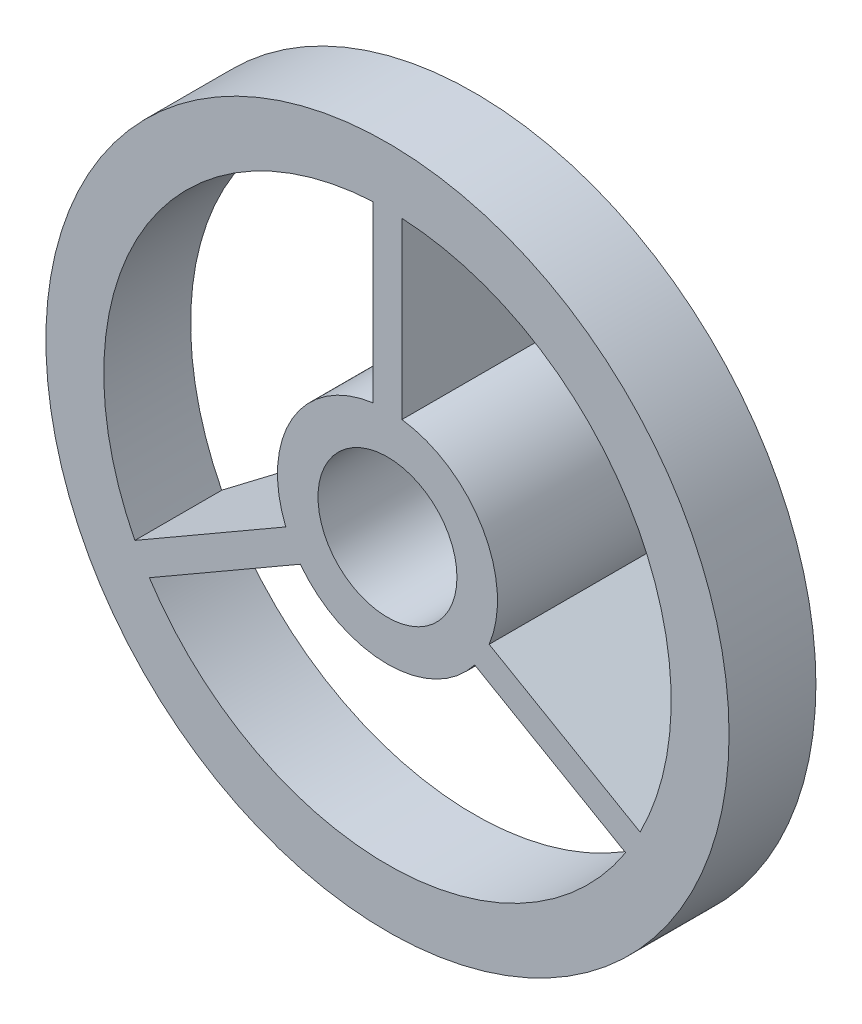
ISO-10303-21;
HEADER;
FILE_DESCRIPTION(('STEP AP214'),'2;1');
FILE_NAME('part.step','',(''),(''),'','','');
FILE_SCHEMA(('AUTOMOTIVE_DESIGN { 1 0 10303 214 1 1 1 1 }'));
ENDSEC;
DATA;
#1=APPLICATION_CONTEXT('core data for automotive mechanical design processes');
#2=APPLICATION_PROTOCOL_DEFINITION('international standard','automotive_design',2000,#1);
#3=PRODUCT_CONTEXT('',#1,'mechanical');
#4=PRODUCT('Part','Part','',(#3));
#5=PRODUCT_RELATED_PRODUCT_CATEGORY('part','',(#4));
#6=PRODUCT_DEFINITION_FORMATION('','',#4);
#7=PRODUCT_DEFINITION_CONTEXT('part definition',#1,'design');
#8=PRODUCT_DEFINITION('design','',#6,#7);
#9=PRODUCT_DEFINITION_SHAPE('','',#8);
#10=(LENGTH_UNIT() NAMED_UNIT(*) SI_UNIT(.MILLI.,.METRE.));
#11=(NAMED_UNIT(*) PLANE_ANGLE_UNIT() SI_UNIT($,.RADIAN.));
#12=(NAMED_UNIT(*) SI_UNIT($,.STERADIAN.) SOLID_ANGLE_UNIT());
#13=UNCERTAINTY_MEASURE_WITH_UNIT(LENGTH_MEASURE(1.E-05),#10,'distance_accuracy_value','');
#14=(GEOMETRIC_REPRESENTATION_CONTEXT(3) GLOBAL_UNCERTAINTY_ASSIGNED_CONTEXT((#13)) GLOBAL_UNIT_ASSIGNED_CONTEXT((#10,
#11,#12)) REPRESENTATION_CONTEXT('',''));
#15=CARTESIAN_POINT('',(0.,0.,0.));
#16=DIRECTION('',(0.,0.,1.));
#17=DIRECTION('',(1.,0.,0.));
#18=AXIS2_PLACEMENT_3D('',#15,#16,#17);
#19=CARTESIAN_POINT('',(0.,0.,3.5));
#20=DIRECTION('',(0.,0.,-1.));
#21=DIRECTION('',(-1.,0.,0.));
#22=AXIS2_PLACEMENT_3D('',#19,#20,#21);
#23=CYLINDRICAL_SURFACE('',#22,1.9);
#24=DIRECTION('',(0.,0.,-1.));
#25=VECTOR('',#24,1.);
#26=CARTESIAN_POINT('',(1.75614223781987,-0.725234059145742,3.5));
#27=LINE('',#26,#25);
#28=CARTESIAN_POINT('',(1.75614223781987,-0.725234059145742,0.));
#29=VERTEX_POINT('',#28);
#30=CARTESIAN_POINT('',(1.75614223781987,-0.725234059145742,3.5));
#31=VERTEX_POINT('',#30);
#32=EDGE_CURVE('E210',#29,#31,#27,.F.);
#33=ORIENTED_EDGE('',*,*,#32,.F.);
#34=CARTESIAN_POINT('',(0.,0.,0.));
#35=DIRECTION('',(0.,0.,1.));
#36=DIRECTION('',(1.,0.,0.));
#37=AXIS2_PLACEMENT_3D('',#34,#35,#36);
#38=CIRCLE('',#37,1.9);
#39=CARTESIAN_POINT('',(0.25,1.88348082018374,0.));
#40=VERTEX_POINT('',#39);
#41=EDGE_CURVE('E332',#29,#40,#38,.T.);
#42=ORIENTED_EDGE('',*,*,#41,.T.);
#43=DIRECTION('',(0.,0.,-1.));
#44=VECTOR('',#43,1.);
#45=CARTESIAN_POINT('',(0.25,1.88348082018374,3.5));
#46=LINE('',#45,#44);
#47=CARTESIAN_POINT('',(0.25,1.88348082018374,3.5));
#48=VERTEX_POINT('',#47);
#49=EDGE_CURVE('E350',#40,#48,#46,.F.);
#50=ORIENTED_EDGE('',*,*,#49,.T.);
#51=CARTESIAN_POINT('',(0.,0.,3.5));
#52=DIRECTION('',(0.,0.,1.));
#53=DIRECTION('',(1.,0.,0.));
#54=AXIS2_PLACEMENT_3D('',#51,#52,#53);
#55=CIRCLE('',#54,1.9);
#56=EDGE_CURVE('E342',#31,#48,#55,.T.);
#57=ORIENTED_EDGE('',*,*,#56,.F.);
#58=EDGE_LOOP('',(#33,#42,#50,#57));
#59=FACE_BOUND('',#58,.T.);
#60=ADVANCED_FACE('F39',(#59),#23,.T.);
#61=CARTESIAN_POINT('',(0.,0.,2.));
#62=DIRECTION('',(0.,0.,1.));
#63=DIRECTION('',(1.,0.,0.));
#64=AXIS2_PLACEMENT_3D('',#61,#62,#63);
#65=PLANE('',#64);
#66=CARTESIAN_POINT('',(0.,0.,2.));
#67=DIRECTION('',(0.,0.,1.));
#68=DIRECTION('',(1.,0.,0.));
#69=AXIS2_PLACEMENT_3D('',#66,#67,#68);
#70=CIRCLE('',#69,5.9);
#71=CARTESIAN_POINT('',(5.9,0.,2.));
#72=VERTEX_POINT('',#71);
#73=EDGE_CURVE('E278',#72,#72,#70,.T.);
#74=ORIENTED_EDGE('',*,*,#73,.F.);
#75=EDGE_LOOP('',(#74));
#76=FACE_BOUND('',#75,.T.);
#77=CARTESIAN_POINT('',(0.,0.,2.));
#78=DIRECTION('',(0.,0.,1.));
#79=DIRECTION('',(1.,0.,0.));
#80=AXIS2_PLACEMENT_3D('',#77,#78,#79);
#81=CIRCLE('',#80,4.9);
#82=CARTESIAN_POINT('',(-4.11299775837599,-2.66331549756954,2.));
#83=VERTEX_POINT('',#82);
#84=CARTESIAN_POINT('',(4.11299775837602,-2.66331549756949,2.));
#85=VERTEX_POINT('',#84);
#86=EDGE_CURVE('E272',#83,#85,#81,.T.);
#87=ORIENTED_EDGE('',*,*,#86,.T.);
#88=DIRECTION('',(0.866025403784443,-0.499999999999992,0.));
#89=VECTOR('',#88,1.);
#90=CARTESIAN_POINT('',(-0.124999999999998,-0.216506350946111,2.));
#91=LINE('',#90,#89);
#92=CARTESIAN_POINT('',(4.11852447854377,-2.66650635094607,2.));
#93=VERTEX_POINT('',#92);
#94=EDGE_CURVE('E217',#85,#93,#91,.T.);
#95=ORIENTED_EDGE('',*,*,#94,.T.);
#96=DIRECTION('',(0.499999999999992,0.866025403784443,0.));
#97=VECTOR('',#96,1.);
#98=CARTESIAN_POINT('',(4.11852447854377,-2.66650635094607,2.));
#99=LINE('',#98,#97);
#100=CARTESIAN_POINT('',(4.36852447854377,-2.23349364905385,2.));
#101=VERTEX_POINT('',#100);
#102=EDGE_CURVE('E55',#93,#101,#99,.T.);
#103=ORIENTED_EDGE('',*,*,#102,.T.);
#104=DIRECTION('',(0.866025403784443,-0.499999999999992,0.));
#105=VECTOR('',#104,1.);
#106=CARTESIAN_POINT('',(0.124999999999998,0.216506350946111,2.));
#107=LINE('',#106,#105);
#108=CARTESIAN_POINT('',(4.36299775837602,-2.23030279567726,2.));
#109=VERTEX_POINT('',#108);
#110=EDGE_CURVE('E207',#109,#101,#107,.T.);
#111=ORIENTED_EDGE('',*,*,#110,.F.);
#112=CARTESIAN_POINT('',(0.25,4.89361829324683,2.));
#113=VERTEX_POINT('',#112);
#114=EDGE_CURVE('E273',#109,#113,#81,.T.);
#115=ORIENTED_EDGE('',*,*,#114,.T.);
#116=DIRECTION('',(0.,-1.,0.));
#117=VECTOR('',#116,1.);
#118=CARTESIAN_POINT('',(0.25,0.,2.));
#119=LINE('',#118,#117);
#120=CARTESIAN_POINT('',(0.25,4.9,2.));
#121=VERTEX_POINT('',#120);
#122=EDGE_CURVE('E292',#121,#113,#119,.T.);
#123=ORIENTED_EDGE('',*,*,#122,.F.);
#124=DIRECTION('',(-1.,0.,0.));
#125=VECTOR('',#124,1.);
#126=CARTESIAN_POINT('',(0.25,4.9,2.));
#127=LINE('',#126,#125);
#128=CARTESIAN_POINT('',(-0.25,4.9,2.));
#129=VERTEX_POINT('',#128);
#130=EDGE_CURVE('E312',#121,#129,#127,.T.);
#131=ORIENTED_EDGE('',*,*,#130,.T.);
#132=DIRECTION('',(0.,-1.,0.));
#133=VECTOR('',#132,1.);
#134=CARTESIAN_POINT('',(-0.25,0.,2.));
#135=LINE('',#134,#133);
#136=CARTESIAN_POINT('',(-0.25,4.89361829324683,2.));
#137=VERTEX_POINT('',#136);
#138=EDGE_CURVE('E296',#129,#137,#135,.T.);
#139=ORIENTED_EDGE('',*,*,#138,.T.);
#140=CARTESIAN_POINT('',(-4.36299775837599,-2.23030279567732,2.));
#141=VERTEX_POINT('',#140);
#142=EDGE_CURVE('E267',#137,#141,#81,.T.);
#143=ORIENTED_EDGE('',*,*,#142,.T.);
#144=DIRECTION('',(-0.866025403784436,-0.500000000000004,0.));
#145=VECTOR('',#144,1.);
#146=CARTESIAN_POINT('',(-0.125000000000001,0.216506350946109,2.));
#147=LINE('',#146,#145);
#148=CARTESIAN_POINT('',(-4.36852447854374,-2.23349364905391,2.));
#149=VERTEX_POINT('',#148);
#150=EDGE_CURVE('E259',#141,#149,#147,.T.);
#151=ORIENTED_EDGE('',*,*,#150,.T.);
#152=DIRECTION('',(0.500000000000004,-0.866025403784436,0.));
#153=VECTOR('',#152,1.);
#154=CARTESIAN_POINT('',(-4.36852447854374,-2.23349364905391,2.));
#155=LINE('',#154,#153);
#156=CARTESIAN_POINT('',(-4.11852447854374,-2.66650635094613,2.));
#157=VERTEX_POINT('',#156);
#158=EDGE_CURVE('E235',#149,#157,#155,.T.);
#159=ORIENTED_EDGE('',*,*,#158,.T.);
#160=DIRECTION('',(-0.866025403784436,-0.500000000000004,0.));
#161=VECTOR('',#160,1.);
#162=CARTESIAN_POINT('',(0.125000000000001,-0.216506350946109,2.));
#163=LINE('',#162,#161);
#164=EDGE_CURVE('E251',#83,#157,#163,.T.);
#165=ORIENTED_EDGE('',*,*,#164,.F.);
#166=EDGE_LOOP('',(#87,#95,#103,#111,#115,#123,#131,#139,#143,#151,#159,#165));
#167=FACE_BOUND('',#166,.T.);
#168=ADVANCED_FACE('F388',(#76,#167),#65,.F.);
#169=CARTESIAN_POINT('',(0.,0.,2.));
#170=DIRECTION('',(0.,0.,1.));
#171=DIRECTION('',(1.,0.,0.));
#172=AXIS2_PLACEMENT_3D('',#169,#170,#171);
#173=CYLINDRICAL_SURFACE('',#172,4.9);
#174=DIRECTION('',(0.,0.,1.));
#175=VECTOR('',#174,1.);
#176=CARTESIAN_POINT('',(4.36299775837602,-2.23030279567726,2.));
#177=LINE('',#176,#175);
#178=CARTESIAN_POINT('',(4.36299775837602,-2.23030279567726,3.5));
#179=VERTEX_POINT('',#178);
#180=EDGE_CURVE('E186',#179,#109,#177,.F.);
#181=ORIENTED_EDGE('',*,*,#180,.F.);
#182=CARTESIAN_POINT('',(0.,0.,3.5));
#183=DIRECTION('',(0.,0.,1.));
#184=DIRECTION('',(1.,0.,0.));
#185=AXIS2_PLACEMENT_3D('',#182,#183,#184);
#186=CIRCLE('',#185,4.9);
#187=CARTESIAN_POINT('',(0.25,4.89361829324683,3.5));
#188=VERTEX_POINT('',#187);
#189=EDGE_CURVE('E266',#179,#188,#186,.T.);
#190=ORIENTED_EDGE('',*,*,#189,.T.);
#191=DIRECTION('',(0.,0.,1.));
#192=VECTOR('',#191,1.);
#193=CARTESIAN_POINT('',(0.25,4.89361829324683,2.));
#194=LINE('',#193,#192);
#195=EDGE_CURVE('E288',#113,#188,#194,.T.);
#196=ORIENTED_EDGE('',*,*,#195,.F.);
#197=ORIENTED_EDGE('',*,*,#114,.F.);
#198=EDGE_LOOP('',(#181,#190,#196,#197));
#199=FACE_BOUND('',#198,.T.);
#200=ADVANCED_FACE('F376',(#199),#173,.F.);
#201=CARTESIAN_POINT('',(-1.50614223781986,-1.15824676103798,0.));
#202=VERTEX_POINT('',#201);
#203=CARTESIAN_POINT('',(1.50614223781988,-1.15824676103796,0.));
#204=VERTEX_POINT('',#203);
#205=EDGE_CURVE('E346',#202,#204,#38,.T.);
#206=ORIENTED_EDGE('',*,*,#205,.T.);
#207=DIRECTION('',(0.,0.,-1.));
#208=VECTOR('',#207,1.);
#209=CARTESIAN_POINT('',(1.50614223781988,-1.15824676103796,3.5));
#210=LINE('',#209,#208);
#211=CARTESIAN_POINT('',(1.50614223781988,-1.15824676103796,3.5));
#212=VERTEX_POINT('',#211);
#213=EDGE_CURVE('E171',#204,#212,#210,.F.);
#214=ORIENTED_EDGE('',*,*,#213,.T.);
#215=CARTESIAN_POINT('',(-1.50614223781986,-1.15824676103798,3.5));
#216=VERTEX_POINT('',#215);
#217=EDGE_CURVE('E341',#216,#212,#55,.T.);
#218=ORIENTED_EDGE('',*,*,#217,.F.);
#219=DIRECTION('',(0.,0.,-1.));
#220=VECTOR('',#219,1.);
#221=CARTESIAN_POINT('',(-1.50614223781986,-1.15824676103798,3.5));
#222=LINE('',#221,#220);
#223=EDGE_CURVE('E255',#202,#216,#222,.F.);
#224=ORIENTED_EDGE('',*,*,#223,.F.);
#225=EDGE_LOOP('',(#206,#214,#218,#224));
#226=FACE_BOUND('',#225,.T.);
#227=ADVANCED_FACE('F397',(#226),#23,.T.);
#228=CARTESIAN_POINT('',(-4.11299775837599,-2.66331549756954,3.5));
#229=VERTEX_POINT('',#228);
#230=CARTESIAN_POINT('',(4.11299775837602,-2.66331549756949,3.5));
#231=VERTEX_POINT('',#230);
#232=EDGE_CURVE('E277',#229,#231,#186,.T.);
#233=ORIENTED_EDGE('',*,*,#232,.T.);
#234=DIRECTION('',(0.,0.,1.));
#235=VECTOR('',#234,1.);
#236=CARTESIAN_POINT('',(4.11299775837602,-2.66331549756949,2.));
#237=LINE('',#236,#235);
#238=EDGE_CURVE('E214',#231,#85,#237,.F.);
#239=ORIENTED_EDGE('',*,*,#238,.T.);
#240=ORIENTED_EDGE('',*,*,#86,.F.);
#241=DIRECTION('',(0.,0.,1.));
#242=VECTOR('',#241,1.);
#243=CARTESIAN_POINT('',(-4.11299775837599,-2.66331549756954,2.));
#244=LINE('',#243,#242);
#245=EDGE_CURVE('E48',#229,#83,#244,.F.);
#246=ORIENTED_EDGE('',*,*,#245,.F.);
#247=EDGE_LOOP('',(#233,#239,#240,#246));
#248=FACE_BOUND('',#247,.T.);
#249=ADVANCED_FACE('F363',(#248),#173,.F.);
#250=CARTESIAN_POINT('',(0.25,0.,0.));
#251=DIRECTION('',(1.,0.,0.));
#252=DIRECTION('',(0.,0.,-1.));
#253=AXIS2_PLACEMENT_3D('',#250,#251,#252);
#254=PLANE('',#253);
#255=DIRECTION('',(0.,0.832050465519294,0.554699939452968));
#256=VECTOR('',#255,1.);
#257=CARTESIAN_POINT('',(0.25,1.89999799408724,0.));
#258=LINE('',#257,#256);
#259=CARTESIAN_POINT('',(0.25,1.89999799408724,0.));
#260=VERTEX_POINT('',#259);
#261=EDGE_CURVE('E308',#260,#121,#258,.T.);
#262=ORIENTED_EDGE('',*,*,#261,.T.);
#263=ORIENTED_EDGE('',*,*,#122,.T.);
#264=ORIENTED_EDGE('',*,*,#195,.T.);
#265=DIRECTION('',(0.,-1.,0.));
#266=VECTOR('',#265,1.);
#267=CARTESIAN_POINT('',(0.25,1.89999799408724,3.5));
#268=LINE('',#267,#266);
#269=EDGE_CURVE('E300',#188,#48,#268,.T.);
#270=ORIENTED_EDGE('',*,*,#269,.T.);
#271=ORIENTED_EDGE('',*,*,#49,.F.);
#272=DIRECTION('',(0.,1.,0.));
#273=VECTOR('',#272,1.);
#274=CARTESIAN_POINT('',(0.25,1.69999799408724,0.));
#275=LINE('',#274,#273);
#276=EDGE_CURVE('E304',#40,#260,#275,.T.);
#277=ORIENTED_EDGE('',*,*,#276,.T.);
#278=EDGE_LOOP('',(#262,#263,#264,#270,#271,#277));
#279=FACE_BOUND('',#278,.T.);
#280=ADVANCED_FACE('F381',(#279),#254,.T.);
#281=CARTESIAN_POINT('',(-0.25,0.,0.));
#282=DIRECTION('',(1.,0.,0.));
#283=DIRECTION('',(0.,0.,-1.));
#284=AXIS2_PLACEMENT_3D('',#281,#282,#283);
#285=PLANE('',#284);
#286=ORIENTED_EDGE('',*,*,#138,.F.);
#287=DIRECTION('',(0.,0.832050465519294,0.554699939452968));
#288=VECTOR('',#287,1.);
#289=CARTESIAN_POINT('',(-0.25,1.89999799408724,0.));
#290=LINE('',#289,#288);
#291=CARTESIAN_POINT('',(-0.25,1.89999799408724,0.));
#292=VERTEX_POINT('',#291);
#293=EDGE_CURVE('E316',#292,#129,#290,.T.);
#294=ORIENTED_EDGE('',*,*,#293,.F.);
#295=DIRECTION('',(0.,1.,0.));
#296=VECTOR('',#295,1.);
#297=CARTESIAN_POINT('',(-0.25,1.69999799408724,0.));
#298=LINE('',#297,#296);
#299=CARTESIAN_POINT('',(-0.25,1.88348082018374,0.));
#300=VERTEX_POINT('',#299);
#301=EDGE_CURVE('E299',#300,#292,#298,.T.);
#302=ORIENTED_EDGE('',*,*,#301,.F.);
#303=DIRECTION('',(0.,0.,-1.));
#304=VECTOR('',#303,1.);
#305=CARTESIAN_POINT('',(-0.25,1.88348082018374,3.5));
#306=LINE('',#305,#304);
#307=CARTESIAN_POINT('',(-0.25,1.88348082018374,3.5));
#308=VERTEX_POINT('',#307);
#309=EDGE_CURVE('E340',#300,#308,#306,.F.);
#310=ORIENTED_EDGE('',*,*,#309,.T.);
#311=DIRECTION('',(0.,-1.,0.));
#312=VECTOR('',#311,1.);
#313=CARTESIAN_POINT('',(-0.25,4.9,3.5));
#314=LINE('',#313,#312);
#315=CARTESIAN_POINT('',(-0.25,4.89361829324683,3.5));
#316=VERTEX_POINT('',#315);
#317=EDGE_CURVE('E305',#316,#308,#314,.T.);
#318=ORIENTED_EDGE('',*,*,#317,.F.);
#319=DIRECTION('',(0.,0.,1.));
#320=VECTOR('',#319,1.);
#321=CARTESIAN_POINT('',(-0.25,4.89361829324683,2.));
#322=LINE('',#321,#320);
#323=EDGE_CURVE('E282',#137,#316,#322,.T.);
#324=ORIENTED_EDGE('',*,*,#323,.F.);
#325=EDGE_LOOP('',(#286,#294,#302,#310,#318,#324));
#326=FACE_BOUND('',#325,.T.);
#327=ADVANCED_FACE('F419',(#326),#285,.F.);
#328=CARTESIAN_POINT('',(0.,0.,3.5));
#329=DIRECTION('',(0.,0.,1.));
#330=DIRECTION('',(1.,0.,0.));
#331=AXIS2_PLACEMENT_3D('',#328,#329,#330);
#332=PLANE('',#331);
#333=DIRECTION('',(-0.866025403784443,0.499999999999992,0.));
#334=VECTOR('',#333,1.);
#335=CARTESIAN_POINT('',(4.36852447854377,-2.23349364905385,3.5));
#336=LINE('',#335,#334);
#337=EDGE_CURVE('E200',#179,#31,#336,.T.);
#338=ORIENTED_EDGE('',*,*,#337,.T.);
#339=ORIENTED_EDGE('',*,*,#56,.T.);
#340=ORIENTED_EDGE('',*,*,#269,.F.);
#341=ORIENTED_EDGE('',*,*,#189,.F.);
#342=EDGE_LOOP('',(#338,#339,#340,#341));
#343=FACE_BOUND('',#342,.T.);
#344=ORIENTED_EDGE('',*,*,#217,.T.);
#345=DIRECTION('',(-0.866025403784443,0.499999999999992,0.));
#346=VECTOR('',#345,1.);
#347=CARTESIAN_POINT('',(1.52044653001904,-1.16650534798972,3.5));
#348=LINE('',#347,#346);
#349=EDGE_CURVE('E175',#231,#212,#348,.T.);
#350=ORIENTED_EDGE('',*,*,#349,.F.);
#351=ORIENTED_EDGE('',*,*,#232,.F.);
#352=DIRECTION('',(0.866025403784436,0.500000000000004,0.));
#353=VECTOR('',#352,1.);
#354=CARTESIAN_POINT('',(-4.11852447854374,-2.66650635094613,3.5));
#355=LINE('',#354,#353);
#356=EDGE_CURVE('E228',#229,#216,#355,.T.);
#357=ORIENTED_EDGE('',*,*,#356,.T.);
#358=EDGE_LOOP('',(#344,#350,#351,#357));
#359=FACE_BOUND('',#358,.T.);
#360=CARTESIAN_POINT('',(-1.75614223781986,-0.725234059145766,3.5));
#361=VERTEX_POINT('',#360);
#362=EDGE_CURVE('E336',#308,#361,#55,.T.);
#363=ORIENTED_EDGE('',*,*,#362,.T.);
#364=DIRECTION('',(0.866025403784436,0.500000000000004,0.));
#365=VECTOR('',#364,1.);
#366=CARTESIAN_POINT('',(-1.77044653001903,-0.73349264609752,3.5));
#367=LINE('',#366,#365);
#368=CARTESIAN_POINT('',(-4.36299775837599,-2.23030279567732,3.5));
#369=VERTEX_POINT('',#368);
#370=EDGE_CURVE('E223',#369,#361,#367,.T.);
#371=ORIENTED_EDGE('',*,*,#370,.F.);
#372=EDGE_CURVE('E274',#316,#369,#186,.T.);
#373=ORIENTED_EDGE('',*,*,#372,.F.);
#374=ORIENTED_EDGE('',*,*,#317,.T.);
#375=EDGE_LOOP('',(#363,#371,#373,#374));
#376=FACE_BOUND('',#375,.T.);
#377=CARTESIAN_POINT('',(0.,0.,3.5));
#378=DIRECTION('',(0.,0.,1.));
#379=DIRECTION('',(1.,0.,0.));
#380=AXIS2_PLACEMENT_3D('',#377,#378,#379);
#381=CIRCLE('',#380,5.9);
#382=CARTESIAN_POINT('',(5.9,0.,3.5));
#383=VERTEX_POINT('',#382);
#384=EDGE_CURVE('E271',#383,#383,#381,.T.);
#385=ORIENTED_EDGE('',*,*,#384,.T.);
#386=EDGE_LOOP('',(#385));
#387=FACE_BOUND('',#386,.T.);
#388=CARTESIAN_POINT('',(0.,0.,3.5));
#389=DIRECTION('',(0.,0.,1.));
#390=DIRECTION('',(1.,0.,0.));
#391=AXIS2_PLACEMENT_3D('',#388,#389,#390);
#392=CIRCLE('',#391,1.2);
#393=CARTESIAN_POINT('',(1.2,0.,3.5));
#394=VERTEX_POINT('',#393);
#395=EDGE_CURVE('E328',#394,#394,#392,.T.);
#396=ORIENTED_EDGE('',*,*,#395,.F.);
#397=EDGE_LOOP('',(#396));
#398=FACE_BOUND('',#397,.T.);
#399=ADVANCED_FACE('F369',(#343,#359,#376,#387,#398),#332,.T.);
#400=CARTESIAN_POINT('',(0.,0.,0.));
#401=DIRECTION('',(0.,0.,1.));
#402=DIRECTION('',(1.,0.,0.));
#403=AXIS2_PLACEMENT_3D('',#400,#401,#402);
#404=PLANE('',#403);
#405=DIRECTION('',(0.866025403784443,-0.499999999999992,0.));
#406=VECTOR('',#405,1.);
#407=CARTESIAN_POINT('',(1.59724144926215,-0.633492646097497,0.));
#408=LINE('',#407,#406);
#409=CARTESIAN_POINT('',(1.77044653001904,-0.733492646097496,0.));
#410=VERTEX_POINT('',#409);
#411=EDGE_CURVE('E183',#29,#410,#408,.T.);
#412=ORIENTED_EDGE('',*,*,#411,.T.);
#413=DIRECTION('',(0.499999999999992,0.866025403784443,0.));
#414=VECTOR('',#413,1.);
#415=CARTESIAN_POINT('',(1.52044653001904,-1.16650534798972,0.));
#416=LINE('',#415,#414);
#417=CARTESIAN_POINT('',(1.52044653001904,-1.16650534798972,0.));
#418=VERTEX_POINT('',#417);
#419=EDGE_CURVE('E178',#418,#410,#416,.T.);
#420=ORIENTED_EDGE('',*,*,#419,.F.);
#421=DIRECTION('',(0.866025403784443,-0.499999999999992,0.));
#422=VECTOR('',#421,1.);
#423=CARTESIAN_POINT('',(1.34724144926215,-1.06650534798972,0.));
#424=LINE('',#423,#422);
#425=EDGE_CURVE('E165',#204,#418,#424,.T.);
#426=ORIENTED_EDGE('',*,*,#425,.F.);
#427=ORIENTED_EDGE('',*,*,#205,.F.);
#428=DIRECTION('',(-0.866025403784436,-0.500000000000004,0.));
#429=VECTOR('',#428,1.);
#430=CARTESIAN_POINT('',(-1.34724144926214,-1.06650534798974,0.));
#431=LINE('',#430,#429);
#432=CARTESIAN_POINT('',(-1.52044653001902,-1.16650534798974,0.));
#433=VERTEX_POINT('',#432);
#434=EDGE_CURVE('E222',#202,#433,#431,.T.);
#435=ORIENTED_EDGE('',*,*,#434,.T.);
#436=DIRECTION('',(0.500000000000004,-0.866025403784436,0.));
#437=VECTOR('',#436,1.);
#438=CARTESIAN_POINT('',(-1.77044653001903,-0.73349264609752,0.));
#439=LINE('',#438,#437);
#440=CARTESIAN_POINT('',(-1.77044653001903,-0.73349264609752,0.));
#441=VERTEX_POINT('',#440);
#442=EDGE_CURVE('E248',#441,#433,#439,.T.);
#443=ORIENTED_EDGE('',*,*,#442,.F.);
#444=DIRECTION('',(-0.866025403784436,-0.500000000000004,0.));
#445=VECTOR('',#444,1.);
#446=CARTESIAN_POINT('',(-1.59724144926214,-0.63349264609752,0.));
#447=LINE('',#446,#445);
#448=CARTESIAN_POINT('',(-1.75614223781986,-0.725234059145766,0.));
#449=VERTEX_POINT('',#448);
#450=EDGE_CURVE('E227',#449,#441,#447,.T.);
#451=ORIENTED_EDGE('',*,*,#450,.F.);
#452=EDGE_CURVE('E343',#300,#449,#38,.T.);
#453=ORIENTED_EDGE('',*,*,#452,.F.);
#454=ORIENTED_EDGE('',*,*,#301,.T.);
#455=DIRECTION('',(-1.,0.,0.));
#456=VECTOR('',#455,1.);
#457=CARTESIAN_POINT('',(0.25,1.89999799408724,0.));
#458=LINE('',#457,#456);
#459=EDGE_CURVE('E324',#260,#292,#458,.T.);
#460=ORIENTED_EDGE('',*,*,#459,.F.);
#461=ORIENTED_EDGE('',*,*,#276,.F.);
#462=ORIENTED_EDGE('',*,*,#41,.F.);
#463=EDGE_LOOP('',(#412,#420,#426,#427,#435,#443,#451,#453,#454,#460,#461,#462));
#464=FACE_BOUND('',#463,.T.);
#465=CARTESIAN_POINT('',(0.,0.,0.));
#466=DIRECTION('',(0.,0.,1.));
#467=DIRECTION('',(1.,0.,0.));
#468=AXIS2_PLACEMENT_3D('',#465,#466,#467);
#469=CIRCLE('',#468,1.2);
#470=CARTESIAN_POINT('',(1.2,0.,0.));
#471=VERTEX_POINT('',#470);
#472=EDGE_CURVE('E327',#471,#471,#469,.T.);
#473=ORIENTED_EDGE('',*,*,#472,.T.);
#474=EDGE_LOOP('',(#473));
#475=FACE_BOUND('',#474,.T.);
#476=ADVANCED_FACE('F179',(#464,#475),#404,.F.);
#477=ORIENTED_EDGE('',*,*,#452,.T.);
#478=DIRECTION('',(0.,0.,-1.));
#479=VECTOR('',#478,1.);
#480=CARTESIAN_POINT('',(-1.75614223781986,-0.725234059145767,3.5));
#481=LINE('',#480,#479);
#482=EDGE_CURVE('E263',#449,#361,#481,.F.);
#483=ORIENTED_EDGE('',*,*,#482,.T.);
#484=ORIENTED_EDGE('',*,*,#362,.F.);
#485=ORIENTED_EDGE('',*,*,#309,.F.);
#486=EDGE_LOOP('',(#477,#483,#484,#485));
#487=FACE_BOUND('',#486,.T.);
#488=ADVANCED_FACE('F41',(#487),#23,.T.);
#489=CARTESIAN_POINT('',(0.,0.,3.5));
#490=DIRECTION('',(0.,0.,-1.));
#491=DIRECTION('',(-1.,0.,0.));
#492=AXIS2_PLACEMENT_3D('',#489,#490,#491);
#493=CYLINDRICAL_SURFACE('',#492,1.2);
#494=ORIENTED_EDGE('',*,*,#395,.T.);
#495=EDGE_LOOP('',(#494));
#496=FACE_BOUND('',#495,.T.);
#497=ORIENTED_EDGE('',*,*,#472,.F.);
#498=EDGE_LOOP('',(#497));
#499=FACE_BOUND('',#498,.T.);
#500=ADVANCED_FACE('F437',(#496,#499),#493,.F.);
#501=CARTESIAN_POINT('',(0.25,1.89999799408724,0.));
#502=DIRECTION('',(0.,-0.554699939452968,0.832050465519294));
#503=DIRECTION('',(0.,-0.832050465519294,-0.554699939452968));
#504=AXIS2_PLACEMENT_3D('',#501,#502,#503);
#505=PLANE('',#504);
#506=ORIENTED_EDGE('',*,*,#293,.T.);
#507=ORIENTED_EDGE('',*,*,#130,.F.);
#508=ORIENTED_EDGE('',*,*,#261,.F.);
#509=ORIENTED_EDGE('',*,*,#459,.T.);
#510=EDGE_LOOP('',(#506,#507,#508,#509));
#511=FACE_BOUND('',#510,.T.);
#512=ADVANCED_FACE('F424',(#511),#505,.F.);
#513=ORIENTED_EDGE('',*,*,#372,.T.);
#514=DIRECTION('',(0.,0.,1.));
#515=VECTOR('',#514,1.);
#516=CARTESIAN_POINT('',(-4.36299775837599,-2.23030279567732,2.));
#517=LINE('',#516,#515);
#518=EDGE_CURVE('E11',#369,#141,#517,.F.);
#519=ORIENTED_EDGE('',*,*,#518,.T.);
#520=ORIENTED_EDGE('',*,*,#142,.F.);
#521=ORIENTED_EDGE('',*,*,#323,.T.);
#522=EDGE_LOOP('',(#513,#519,#520,#521));
#523=FACE_BOUND('',#522,.T.);
#524=ADVANCED_FACE('F427',(#523),#173,.F.);
#525=CARTESIAN_POINT('',(0.,0.,2.));
#526=DIRECTION('',(0.,0.,1.));
#527=DIRECTION('',(1.,0.,0.));
#528=AXIS2_PLACEMENT_3D('',#525,#526,#527);
#529=CYLINDRICAL_SURFACE('',#528,5.9);
#530=ORIENTED_EDGE('',*,*,#73,.T.);
#531=EDGE_LOOP('',(#530));
#532=FACE_BOUND('',#531,.T.);
#533=ORIENTED_EDGE('',*,*,#384,.F.);
#534=EDGE_LOOP('',(#533));
#535=FACE_BOUND('',#534,.T.);
#536=ADVANCED_FACE('F429',(#532,#535),#529,.T.);
#537=CARTESIAN_POINT('',(-0.125000000000001,0.216506350946109,0.));
#538=DIRECTION('',(-0.500000000000004,0.866025403784436,0.));
#539=DIRECTION('',(0.,0.,-1.));
#540=AXIS2_PLACEMENT_3D('',#537,#538,#539);
#541=PLANE('',#540);
#542=ORIENTED_EDGE('',*,*,#482,.F.);
#543=ORIENTED_EDGE('',*,*,#450,.T.);
#544=DIRECTION('',(-0.720576840370375,-0.41602523275965,0.554699939452968));
#545=VECTOR('',#544,1.);
#546=CARTESIAN_POINT('',(-1.77044653001903,-0.73349264609752,0.));
#547=LINE('',#546,#545);
#548=EDGE_CURVE('E231',#441,#149,#547,.T.);
#549=ORIENTED_EDGE('',*,*,#548,.T.);
#550=ORIENTED_EDGE('',*,*,#150,.F.);
#551=ORIENTED_EDGE('',*,*,#518,.F.);
#552=ORIENTED_EDGE('',*,*,#370,.T.);
#553=EDGE_LOOP('',(#542,#543,#549,#550,#551,#552));
#554=FACE_BOUND('',#553,.T.);
#555=ADVANCED_FACE('F407',(#554),#541,.T.);
#556=CARTESIAN_POINT('',(0.125000000000001,-0.216506350946109,0.));
#557=DIRECTION('',(-0.500000000000004,0.866025403784436,0.));
#558=DIRECTION('',(0.,0.,-1.));
#559=AXIS2_PLACEMENT_3D('',#556,#557,#558);
#560=PLANE('',#559);
#561=ORIENTED_EDGE('',*,*,#434,.F.);
#562=ORIENTED_EDGE('',*,*,#223,.T.);
#563=ORIENTED_EDGE('',*,*,#356,.F.);
#564=ORIENTED_EDGE('',*,*,#245,.T.);
#565=ORIENTED_EDGE('',*,*,#164,.T.);
#566=DIRECTION('',(-0.720576840370375,-0.41602523275965,0.554699939452968));
#567=VECTOR('',#566,1.);
#568=CARTESIAN_POINT('',(-1.52044653001902,-1.16650534798974,0.));
#569=LINE('',#568,#567);
#570=EDGE_CURVE('E239',#433,#157,#569,.T.);
#571=ORIENTED_EDGE('',*,*,#570,.F.);
#572=EDGE_LOOP('',(#561,#562,#563,#564,#565,#571));
#573=FACE_BOUND('',#572,.T.);
#574=ADVANCED_FACE('F358',(#573),#560,.F.);
#575=CARTESIAN_POINT('',(-1.77044653001903,-0.73349264609752,0.));
#576=DIRECTION('',(0.480384239043959,0.277349969726486,0.832050465519294));
#577=DIRECTION('',(0.866025548548614,0.,-0.499999749261009));
#578=AXIS2_PLACEMENT_3D('',#575,#576,#577);
#579=PLANE('',#578);
#580=ORIENTED_EDGE('',*,*,#570,.T.);
#581=ORIENTED_EDGE('',*,*,#158,.F.);
#582=ORIENTED_EDGE('',*,*,#548,.F.);
#583=ORIENTED_EDGE('',*,*,#442,.T.);
#584=EDGE_LOOP('',(#580,#581,#582,#583));
#585=FACE_BOUND('',#584,.T.);
#586=ADVANCED_FACE('F400',(#585),#579,.F.);
#587=CARTESIAN_POINT('',(-0.124999999999998,-0.216506350946111,0.));
#588=DIRECTION('',(-0.499999999999992,-0.866025403784443,0.));
#589=DIRECTION('',(0.,0.,-1.));
#590=AXIS2_PLACEMENT_3D('',#587,#588,#589);
#591=PLANE('',#590);
#592=ORIENTED_EDGE('',*,*,#213,.F.);
#593=ORIENTED_EDGE('',*,*,#425,.T.);
#594=DIRECTION('',(0.720576840370381,-0.41602523275964,0.554699939452968));
#595=VECTOR('',#594,1.);
#596=CARTESIAN_POINT('',(1.52044653001904,-1.16650534798972,0.));
#597=LINE('',#596,#595);
#598=EDGE_CURVE('E169',#418,#93,#597,.T.);
#599=ORIENTED_EDGE('',*,*,#598,.T.);
#600=ORIENTED_EDGE('',*,*,#94,.F.);
#601=ORIENTED_EDGE('',*,*,#238,.F.);
#602=ORIENTED_EDGE('',*,*,#349,.T.);
#603=EDGE_LOOP('',(#592,#593,#599,#600,#601,#602));
#604=FACE_BOUND('',#603,.T.);
#605=ADVANCED_FACE('F167',(#604),#591,.T.);
#606=CARTESIAN_POINT('',(0.124999999999998,0.216506350946111,0.));
#607=DIRECTION('',(-0.499999999999992,-0.866025403784443,0.));
#608=DIRECTION('',(0.,0.,-1.));
#609=AXIS2_PLACEMENT_3D('',#606,#607,#608);
#610=PLANE('',#609);
#611=ORIENTED_EDGE('',*,*,#411,.F.);
#612=ORIENTED_EDGE('',*,*,#32,.T.);
#613=ORIENTED_EDGE('',*,*,#337,.F.);
#614=ORIENTED_EDGE('',*,*,#180,.T.);
#615=ORIENTED_EDGE('',*,*,#110,.T.);
#616=DIRECTION('',(0.720576840370381,-0.41602523275964,0.554699939452968));
#617=VECTOR('',#616,1.);
#618=CARTESIAN_POINT('',(1.77044653001904,-0.733492646097496,0.));
#619=LINE('',#618,#617);
#620=EDGE_CURVE('E197',#410,#101,#619,.T.);
#621=ORIENTED_EDGE('',*,*,#620,.F.);
#622=EDGE_LOOP('',(#611,#612,#613,#614,#615,#621));
#623=FACE_BOUND('',#622,.T.);
#624=ADVANCED_FACE('F392',(#623),#610,.F.);
#625=CARTESIAN_POINT('',(1.52044653001904,-1.16650534798972,0.));
#626=DIRECTION('',(-0.480384239043963,0.27734996972648,0.832050465519294));
#627=DIRECTION('',(0.866025548548612,0.,0.499999749261012));
#628=AXIS2_PLACEMENT_3D('',#625,#626,#627);
#629=PLANE('',#628);
#630=ORIENTED_EDGE('',*,*,#620,.T.);
#631=ORIENTED_EDGE('',*,*,#102,.F.);
#632=ORIENTED_EDGE('',*,*,#598,.F.);
#633=ORIENTED_EDGE('',*,*,#419,.T.);
#634=EDGE_LOOP('',(#630,#631,#632,#633));
#635=FACE_BOUND('',#634,.T.);
#636=ADVANCED_FACE('F188',(#635),#629,.F.);
#637=CLOSED_SHELL('',(#60,#168,#200,#227,#249,#280,#327,#399,#476,#488,#500,#512,#524,#536,#555,
#574,#586,#605,#624,#636));
#638=MANIFOLD_SOLID_BREP('B2',#637);
#639=ADVANCED_BREP_SHAPE_REPRESENTATION('',(#18,#638),#14);
#640=SHAPE_DEFINITION_REPRESENTATION(#9,#639);
ENDSEC;
END-ISO-10303-21;
